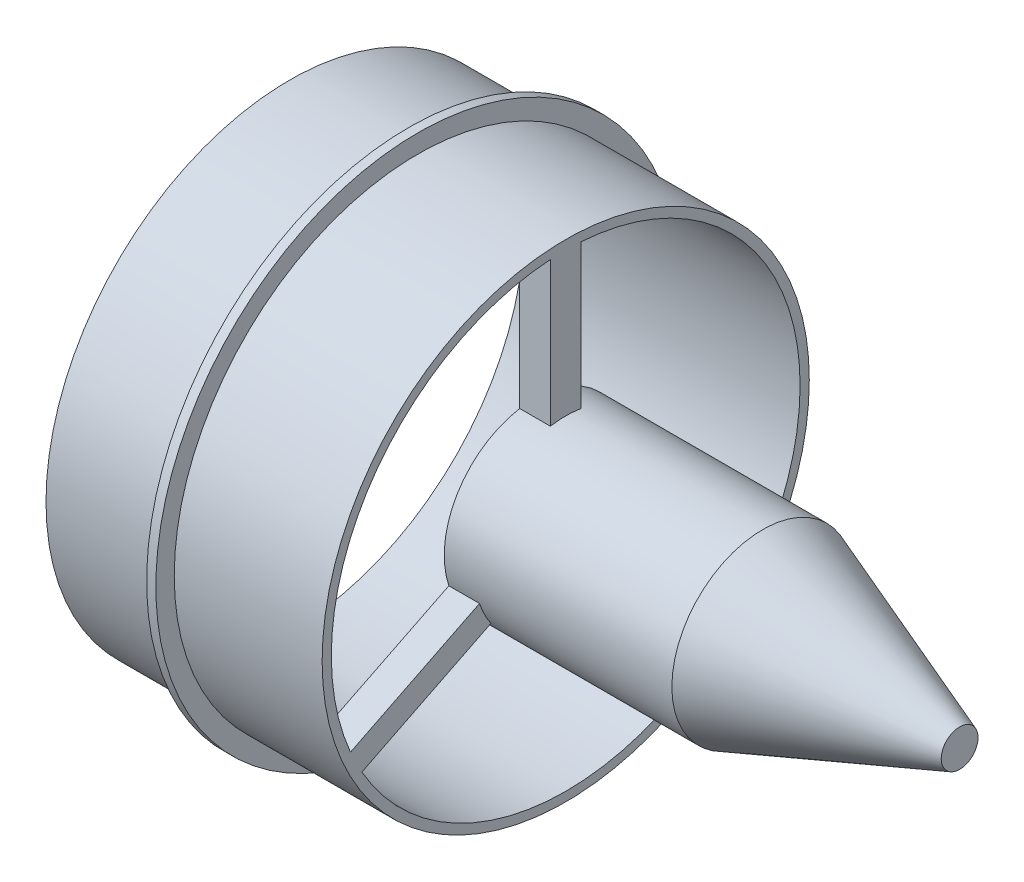
ISO-10303-21;
HEADER;
FILE_DESCRIPTION(('STEP AP214'),'2;1');
FILE_NAME('part.step','',(''),(''),'','','');
FILE_SCHEMA(('AUTOMOTIVE_DESIGN { 1 0 10303 214 1 1 1 1 }'));
ENDSEC;
DATA;
#1=APPLICATION_CONTEXT('core data for automotive mechanical design processes');
#2=APPLICATION_PROTOCOL_DEFINITION('international standard','automotive_design',2000,#1);
#3=PRODUCT_CONTEXT('',#1,'mechanical');
#4=PRODUCT('Part','Part','',(#3));
#5=PRODUCT_RELATED_PRODUCT_CATEGORY('part','',(#4));
#6=PRODUCT_DEFINITION_FORMATION('','',#4);
#7=PRODUCT_DEFINITION_CONTEXT('part definition',#1,'design');
#8=PRODUCT_DEFINITION('design','',#6,#7);
#9=PRODUCT_DEFINITION_SHAPE('','',#8);
#10=(LENGTH_UNIT() NAMED_UNIT(*) SI_UNIT(.MILLI.,.METRE.));
#11=(NAMED_UNIT(*) PLANE_ANGLE_UNIT() SI_UNIT($,.RADIAN.));
#12=(NAMED_UNIT(*) SI_UNIT($,.STERADIAN.) SOLID_ANGLE_UNIT());
#13=UNCERTAINTY_MEASURE_WITH_UNIT(LENGTH_MEASURE(1.E-05),#10,'distance_accuracy_value','');
#14=(GEOMETRIC_REPRESENTATION_CONTEXT(3) GLOBAL_UNCERTAINTY_ASSIGNED_CONTEXT((#13)) GLOBAL_UNIT_ASSIGNED_CONTEXT((#10,
#11,#12)) REPRESENTATION_CONTEXT('',''));
#15=CARTESIAN_POINT('',(0.,0.,0.));
#16=DIRECTION('',(0.,0.,1.));
#17=DIRECTION('',(1.,0.,0.));
#18=AXIS2_PLACEMENT_3D('',#15,#16,#17);
#19=CARTESIAN_POINT('',(45.,0.,0.));
#20=DIRECTION('',(-1.,0.,0.));
#21=DIRECTION('',(0.,0.,1.));
#22=AXIS2_PLACEMENT_3D('',#19,#20,#21);
#23=CYLINDRICAL_SURFACE('',#22,39.7);
#24=CARTESIAN_POINT('',(0.,0.,0.));
#25=DIRECTION('',(1.,0.,0.));
#26=DIRECTION('',(0.,0.,-1.));
#27=AXIS2_PLACEMENT_3D('',#24,#25,#26);
#28=CIRCLE('',#27,39.7);
#29=CARTESIAN_POINT('',(0.,0.,39.7));
#30=VERTEX_POINT('',#29);
#31=EDGE_CURVE('E175',#30,#30,#28,.T.);
#32=CARTESIAN_POINT('',(19.4,0.,0.));
#33=DIRECTION('',(1.,0.,0.));
#34=DIRECTION('',(0.,0.,-1.));
#35=AXIS2_PLACEMENT_3D('',#32,#33,#34);
#36=CIRCLE('',#35,39.7);
#37=CARTESIAN_POINT('',(19.4,0.,39.7));
#38=VERTEX_POINT('',#37);
#39=EDGE_CURVE('E168',#38,#38,#36,.T.);
#40=CARTESIAN_POINT('',(0.,0.,39.7));
#41=CARTESIAN_POINT('',(0.202083333333327,0.,39.7));
#42=CARTESIAN_POINT('',(0.404166666666662,0.,39.7));
#43=CARTESIAN_POINT('',(0.808333333333328,0.,39.7));
#44=CARTESIAN_POINT('',(1.01041666666666,0.,39.7));
#45=CARTESIAN_POINT('',(1.41458333333333,0.,39.7));
#46=CARTESIAN_POINT('',(1.61666666666666,0.,39.7));
#47=CARTESIAN_POINT('',(2.02083333333333,0.,39.7));
#48=CARTESIAN_POINT('',(2.22291666666666,0.,39.7));
#49=CARTESIAN_POINT('',(2.62708333333333,0.,39.7));
#50=CARTESIAN_POINT('',(2.82916666666666,0.,39.7));
#51=CARTESIAN_POINT('',(3.23333333333333,0.,39.7));
#52=CARTESIAN_POINT('',(3.43541666666666,0.,39.7));
#53=CARTESIAN_POINT('',(3.83958333333333,0.,39.7));
#54=CARTESIAN_POINT('',(4.04166666666666,0.,39.7));
#55=CARTESIAN_POINT('',(4.44583333333333,0.,39.7));
#56=CARTESIAN_POINT('',(4.64791666666666,0.,39.7));
#57=CARTESIAN_POINT('',(5.05208333333333,0.,39.7));
#58=CARTESIAN_POINT('',(5.25416666666666,0.,39.7));
#59=CARTESIAN_POINT('',(5.65833333333333,0.,39.7));
#60=CARTESIAN_POINT('',(5.86041666666666,0.,39.7));
#61=CARTESIAN_POINT('',(6.26458333333333,0.,39.7));
#62=CARTESIAN_POINT('',(6.46666666666666,0.,39.7));
#63=CARTESIAN_POINT('',(6.87083333333333,0.,39.7));
#64=CARTESIAN_POINT('',(7.07291666666666,0.,39.7));
#65=CARTESIAN_POINT('',(7.47708333333333,0.,39.7));
#66=CARTESIAN_POINT('',(7.67916666666666,0.,39.7));
#67=CARTESIAN_POINT('',(8.08333333333333,0.,39.7));
#68=CARTESIAN_POINT('',(8.28541666666666,0.,39.7));
#69=CARTESIAN_POINT('',(8.68958333333333,0.,39.7));
#70=CARTESIAN_POINT('',(8.89166666666666,0.,39.7));
#71=CARTESIAN_POINT('',(9.29583333333333,0.,39.7));
#72=CARTESIAN_POINT('',(9.49791666666666,0.,39.7));
#73=CARTESIAN_POINT('',(9.90208333333333,0.,39.7));
#74=CARTESIAN_POINT('',(10.1041666666667,0.,39.7));
#75=CARTESIAN_POINT('',(10.5083333333333,0.,39.7));
#76=CARTESIAN_POINT('',(10.7104166666667,0.,39.7));
#77=CARTESIAN_POINT('',(11.1145833333333,0.,39.7));
#78=CARTESIAN_POINT('',(11.3166666666667,0.,39.7));
#79=CARTESIAN_POINT('',(11.7208333333333,0.,39.7));
#80=CARTESIAN_POINT('',(11.9229166666667,0.,39.7));
#81=CARTESIAN_POINT('',(12.3270833333333,0.,39.7));
#82=CARTESIAN_POINT('',(12.5291666666667,0.,39.7));
#83=CARTESIAN_POINT('',(12.9333333333333,0.,39.7));
#84=CARTESIAN_POINT('',(13.1354166666667,0.,39.7));
#85=CARTESIAN_POINT('',(13.5395833333333,0.,39.7));
#86=CARTESIAN_POINT('',(13.7416666666667,0.,39.7));
#87=CARTESIAN_POINT('',(14.1458333333333,0.,39.7));
#88=CARTESIAN_POINT('',(14.3479166666667,0.,39.7));
#89=CARTESIAN_POINT('',(14.7520833333333,0.,39.7));
#90=CARTESIAN_POINT('',(14.9541666666667,0.,39.7));
#91=CARTESIAN_POINT('',(15.3583333333333,0.,39.7));
#92=CARTESIAN_POINT('',(15.5604166666667,0.,39.7));
#93=CARTESIAN_POINT('',(15.9645833333333,0.,39.7));
#94=CARTESIAN_POINT('',(16.1666666666667,0.,39.7));
#95=CARTESIAN_POINT('',(16.5708333333333,0.,39.7));
#96=CARTESIAN_POINT('',(16.7729166666667,0.,39.7));
#97=CARTESIAN_POINT('',(17.1770833333333,0.,39.7));
#98=CARTESIAN_POINT('',(17.3791666666667,0.,39.7));
#99=CARTESIAN_POINT('',(17.7833333333333,0.,39.7));
#100=CARTESIAN_POINT('',(17.9854166666667,0.,39.7));
#101=CARTESIAN_POINT('',(18.3895833333333,0.,39.7));
#102=CARTESIAN_POINT('',(18.5916666666667,0.,39.7));
#103=CARTESIAN_POINT('',(18.9958333333333,0.,39.7));
#104=CARTESIAN_POINT('',(19.1979166666667,0.,39.7));
#105=CARTESIAN_POINT('',(19.4,0.,39.7));
#106=B_SPLINE_CURVE_WITH_KNOTS('',3,(#40,#41,#42,#43,#44,#45,#46,#47,#48,#49,#50,#51,#52,#53,
#54,#55,#56,#57,#58,#59,#60,#61,#62,#63,#64,#65,#66,#67,#68,#69,#70,#71,#72,#73,#74,#75,#76,#77,
#78,#79,#80,#81,#82,#83,#84,#85,#86,#87,#88,#89,#90,#91,#92,#93,#94,#95,#96,#97,#98,#99,#100,
#101,#102,#103,#104,#105),.UNSPECIFIED.,.F.,.F.,(4,2,2,2,2,2,2,2,2,2,2,2,2,2,2,2,2,2,2,2,2,2,2,
2,2,2,2,2,2,2,2,2,4),(0.,0.606250000000003,1.2125,1.81875,2.425,3.03125,3.6375,4.24375,4.85,
5.45625,6.0625,6.66875,7.275,7.88125000000001,8.4875,9.09375000000001,9.7,10.30625,10.9125,
11.51875,12.125,12.73125,13.3375,13.94375,14.55,15.15625,15.7625,16.36875,16.975,17.58125,
18.1875,18.79375,19.4),.UNSPECIFIED.);
#107=EDGE_CURVE('BSEAM41',#30,#38,#106,.T.);
#108=ORIENTED_EDGE('',*,*,#31,.T.);
#109=ORIENTED_EDGE('',*,*,#39,.F.);
#110=ORIENTED_EDGE('',*,*,#107,.T.);
#111=ORIENTED_EDGE('',*,*,#107,.F.);
#112=EDGE_LOOP('',(#108,#110,#109,#111));
#113=FACE_BOUND('',#112,.T.);
#114=ADVANCED_FACE('F41',(#113),#23,.T.);
#115=CARTESIAN_POINT('',(20.9,0.,0.));
#116=DIRECTION('',(1.,0.,0.));
#117=DIRECTION('',(0.,0.,-1.));
#118=AXIS2_PLACEMENT_3D('',#115,#116,#117);
#119=CIRCLE('',#118,39.7);
#120=CARTESIAN_POINT('',(20.9,0.,39.7));
#121=VERTEX_POINT('',#120);
#122=EDGE_CURVE('E191',#121,#121,#119,.T.);
#123=CARTESIAN_POINT('',(45.,0.,0.));
#124=DIRECTION('',(1.,0.,0.));
#125=DIRECTION('',(0.,0.,-1.));
#126=AXIS2_PLACEMENT_3D('',#123,#124,#125);
#127=CIRCLE('',#126,39.7);
#128=CARTESIAN_POINT('',(45.,0.,39.7));
#129=VERTEX_POINT('',#128);
#130=EDGE_CURVE('E170',#129,#129,#127,.T.);
#131=CARTESIAN_POINT('',(20.9,0.,39.7));
#132=CARTESIAN_POINT('',(21.1510416666667,0.,39.7));
#133=CARTESIAN_POINT('',(21.4020833333333,0.,39.7));
#134=CARTESIAN_POINT('',(21.9041666666667,0.,39.7));
#135=CARTESIAN_POINT('',(22.1552083333333,0.,39.7));
#136=CARTESIAN_POINT('',(22.6572916666667,0.,39.7));
#137=CARTESIAN_POINT('',(22.9083333333333,0.,39.7));
#138=CARTESIAN_POINT('',(23.4104166666667,0.,39.7));
#139=CARTESIAN_POINT('',(23.6614583333333,0.,39.7));
#140=CARTESIAN_POINT('',(24.1635416666667,0.,39.7));
#141=CARTESIAN_POINT('',(24.4145833333333,0.,39.7));
#142=CARTESIAN_POINT('',(24.9166666666667,0.,39.7));
#143=CARTESIAN_POINT('',(25.1677083333333,0.,39.7));
#144=CARTESIAN_POINT('',(25.6697916666667,0.,39.7));
#145=CARTESIAN_POINT('',(25.9208333333333,0.,39.7));
#146=CARTESIAN_POINT('',(26.4229166666667,0.,39.7));
#147=CARTESIAN_POINT('',(26.6739583333333,0.,39.7));
#148=CARTESIAN_POINT('',(27.1760416666667,0.,39.7));
#149=CARTESIAN_POINT('',(27.4270833333333,0.,39.7));
#150=CARTESIAN_POINT('',(27.9291666666667,0.,39.7));
#151=CARTESIAN_POINT('',(28.1802083333333,0.,39.7));
#152=CARTESIAN_POINT('',(28.6822916666667,0.,39.7));
#153=CARTESIAN_POINT('',(28.9333333333333,0.,39.7));
#154=CARTESIAN_POINT('',(29.4354166666667,0.,39.7));
#155=CARTESIAN_POINT('',(29.6864583333333,0.,39.7));
#156=CARTESIAN_POINT('',(30.1885416666667,0.,39.7));
#157=CARTESIAN_POINT('',(30.4395833333333,0.,39.7));
#158=CARTESIAN_POINT('',(30.9416666666667,0.,39.7));
#159=CARTESIAN_POINT('',(31.1927083333333,0.,39.7));
#160=CARTESIAN_POINT('',(31.6947916666667,0.,39.7));
#161=CARTESIAN_POINT('',(31.9458333333333,0.,39.7));
#162=CARTESIAN_POINT('',(32.4479166666667,0.,39.7));
#163=CARTESIAN_POINT('',(32.6989583333333,0.,39.7));
#164=CARTESIAN_POINT('',(33.2010416666667,0.,39.7));
#165=CARTESIAN_POINT('',(33.4520833333333,0.,39.7));
#166=CARTESIAN_POINT('',(33.9541666666667,0.,39.7));
#167=CARTESIAN_POINT('',(34.2052083333333,0.,39.7));
#168=CARTESIAN_POINT('',(34.7072916666667,0.,39.7));
#169=CARTESIAN_POINT('',(34.9583333333333,0.,39.7));
#170=CARTESIAN_POINT('',(35.4604166666667,0.,39.7));
#171=CARTESIAN_POINT('',(35.7114583333333,0.,39.7));
#172=CARTESIAN_POINT('',(36.2135416666667,0.,39.7));
#173=CARTESIAN_POINT('',(36.4645833333333,0.,39.7));
#174=CARTESIAN_POINT('',(36.9666666666667,0.,39.7));
#175=CARTESIAN_POINT('',(37.2177083333333,0.,39.7));
#176=CARTESIAN_POINT('',(37.7197916666667,0.,39.7));
#177=CARTESIAN_POINT('',(37.9708333333333,0.,39.7));
#178=CARTESIAN_POINT('',(38.4729166666667,0.,39.7));
#179=CARTESIAN_POINT('',(38.7239583333333,0.,39.7));
#180=CARTESIAN_POINT('',(39.2260416666667,0.,39.7));
#181=CARTESIAN_POINT('',(39.4770833333333,0.,39.7));
#182=CARTESIAN_POINT('',(39.9791666666667,0.,39.7));
#183=CARTESIAN_POINT('',(40.2302083333333,0.,39.7));
#184=CARTESIAN_POINT('',(40.7322916666667,0.,39.7));
#185=CARTESIAN_POINT('',(40.9833333333333,0.,39.7));
#186=CARTESIAN_POINT('',(41.4854166666667,0.,39.7));
#187=CARTESIAN_POINT('',(41.7364583333333,0.,39.7));
#188=CARTESIAN_POINT('',(42.2385416666667,0.,39.7));
#189=CARTESIAN_POINT('',(42.4895833333333,0.,39.7));
#190=CARTESIAN_POINT('',(42.9916666666667,0.,39.7));
#191=CARTESIAN_POINT('',(43.2427083333333,0.,39.7));
#192=CARTESIAN_POINT('',(43.7447916666667,0.,39.7));
#193=CARTESIAN_POINT('',(43.9958333333333,0.,39.7));
#194=CARTESIAN_POINT('',(44.4979166666667,0.,39.7));
#195=CARTESIAN_POINT('',(44.7489583333333,0.,39.7));
#196=CARTESIAN_POINT('',(45.,0.,39.7));
#197=B_SPLINE_CURVE_WITH_KNOTS('',3,(#131,#132,#133,#134,#135,#136,#137,#138,#139,#140,#141,
#142,#143,#144,#145,#146,#147,#148,#149,#150,#151,#152,#153,#154,#155,#156,#157,#158,#159,#160,
#161,#162,#163,#164,#165,#166,#167,#168,#169,#170,#171,#172,#173,#174,#175,#176,#177,#178,#179,
#180,#181,#182,#183,#184,#185,#186,#187,#188,#189,#190,#191,#192,#193,#194,#195,#196),
.UNSPECIFIED.,.F.,.F.,(4,2,2,2,2,2,2,2,2,2,2,2,2,2,2,2,2,2,2,2,2,2,2,2,2,2,2,2,2,2,2,2,4),(0.,
0.753125,1.50625,2.259375,3.0125,3.765625,4.51875,5.271875,6.025,6.778125,7.53125,8.284375,
9.0375,9.790625,10.54375,11.296875,12.05,12.803125,13.55625,14.309375,15.0625,15.815625,
16.56875,17.321875,18.075,18.828125,19.58125,20.334375,21.0875,21.840625,22.59375,23.346875,
24.1),.UNSPECIFIED.);
#198=EDGE_CURVE('BSEAM43',#121,#129,#197,.T.);
#199=ORIENTED_EDGE('',*,*,#122,.T.);
#200=ORIENTED_EDGE('',*,*,#130,.F.);
#201=ORIENTED_EDGE('',*,*,#198,.T.);
#202=ORIENTED_EDGE('',*,*,#198,.F.);
#203=EDGE_LOOP('',(#199,#201,#200,#202));
#204=FACE_BOUND('',#203,.T.);
#205=ADVANCED_FACE('F43',(#204),#23,.T.);
#206=CARTESIAN_POINT('',(45.,0.,0.));
#207=DIRECTION('',(1.,0.,0.));
#208=DIRECTION('',(0.,0.,-1.));
#209=AXIS2_PLACEMENT_3D('',#206,#207,#208);
#210=PLANE('',#209);
#211=CARTESIAN_POINT('',(45.,0.,0.));
#212=DIRECTION('',(1.,0.,0.));
#213=DIRECTION('',(0.,0.,-1.));
#214=AXIS2_PLACEMENT_3D('',#211,#212,#213);
#215=CIRCLE('',#214,14.8);
#216=CARTESIAN_POINT('',(45.,14.5873232637109,-2.5));
#217=VERTEX_POINT('',#216);
#218=CARTESIAN_POINT('',(45.,14.5873232637109,2.5));
#219=VERTEX_POINT('',#218);
#220=EDGE_CURVE('E52',#217,#219,#215,.T.);
#221=ORIENTED_EDGE('',*,*,#220,.F.);
#222=DIRECTION('',(0.,1.,0.));
#223=VECTOR('',#222,1.);
#224=CARTESIAN_POINT('',(45.,14.5873232637109,-2.5));
#225=LINE('',#224,#223);
#226=CARTESIAN_POINT('',(45.,38.1181059340571,-2.5));
#227=VERTEX_POINT('',#226);
#228=EDGE_CURVE('E133',#217,#227,#225,.T.);
#229=ORIENTED_EDGE('',*,*,#228,.T.);
#230=CARTESIAN_POINT('',(45.,0.,0.));
#231=DIRECTION('',(-1.,0.,0.));
#232=DIRECTION('',(0.,0.,1.));
#233=AXIS2_PLACEMENT_3D('',#230,#231,#232);
#234=CIRCLE('',#233,38.2);
#235=CARTESIAN_POINT('',(45.,-15.1312278528921,-35.0754321949689));
#236=VERTEX_POINT('',#235);
#237=EDGE_CURVE('E179',#227,#236,#234,.T.);
#238=ORIENTED_EDGE('',*,*,#237,.T.);
#239=DIRECTION('',(0.,0.445659530203826,0.895202537495569));
#240=VECTOR('',#239,1.);
#241=CARTESIAN_POINT('',(45.,-4.66234567366432,-14.0464419985726));
#242=LINE('',#241,#240);
#243=CARTESIAN_POINT('',(45.,-4.66234567366432,-14.0464419985726));
#244=VERTEX_POINT('',#243);
#245=EDGE_CURVE('E145',#236,#244,#242,.T.);
#246=ORIENTED_EDGE('',*,*,#245,.T.);
#247=CARTESIAN_POINT('',(45.,-8.39746558109926,-12.1869837045207));
#248=VERTEX_POINT('',#247);
#249=EDGE_CURVE('E50',#248,#244,#215,.T.);
#250=ORIENTED_EDGE('',*,*,#249,.F.);
#251=DIRECTION('',(0.,-0.445659530203826,-0.895202537495569));
#252=VECTOR('',#251,1.);
#253=CARTESIAN_POINT('',(45.,-8.39746558109925,-12.1869837045207));
#254=LINE('',#253,#252);
#255=CARTESIAN_POINT('',(45.,-18.866347760327,-33.215973900917));
#256=VERTEX_POINT('',#255);
#257=EDGE_CURVE('E66',#248,#256,#254,.T.);
#258=ORIENTED_EDGE('',*,*,#257,.T.);
#259=CARTESIAN_POINT('',(45.,-18.866347760327,33.2159739009171));
#260=VERTEX_POINT('',#259);
#261=EDGE_CURVE('E187',#256,#260,#234,.T.);
#262=ORIENTED_EDGE('',*,*,#261,.T.);
#263=DIRECTION('',(0.,0.445659530203826,-0.895202537495569));
#264=VECTOR('',#263,1.);
#265=CARTESIAN_POINT('',(45.,-8.39746558109925,12.1869837045207));
#266=LINE('',#265,#264);
#267=CARTESIAN_POINT('',(45.,-8.39746558109925,12.1869837045207));
#268=VERTEX_POINT('',#267);
#269=EDGE_CURVE('E223',#260,#268,#266,.T.);
#270=ORIENTED_EDGE('',*,*,#269,.T.);
#271=CARTESIAN_POINT('',(45.,-4.66234567366432,14.0464419985726));
#272=VERTEX_POINT('',#271);
#273=EDGE_CURVE('E12',#272,#268,#215,.T.);
#274=ORIENTED_EDGE('',*,*,#273,.F.);
#275=DIRECTION('',(0.,-0.445659530203826,0.895202537495569));
#276=VECTOR('',#275,1.);
#277=CARTESIAN_POINT('',(45.,-4.66234567366432,14.0464419985726));
#278=LINE('',#277,#276);
#279=CARTESIAN_POINT('',(45.,-15.1312278528921,35.0754321949689));
#280=VERTEX_POINT('',#279);
#281=EDGE_CURVE('E59',#272,#280,#278,.T.);
#282=ORIENTED_EDGE('',*,*,#281,.T.);
#283=CARTESIAN_POINT('',(45.,38.1181059340571,2.5));
#284=VERTEX_POINT('',#283);
#285=EDGE_CURVE('E184',#280,#284,#234,.T.);
#286=ORIENTED_EDGE('',*,*,#285,.T.);
#287=DIRECTION('',(0.,-1.,0.));
#288=VECTOR('',#287,1.);
#289=CARTESIAN_POINT('',(45.,14.5873232637109,2.5));
#290=LINE('',#289,#288);
#291=EDGE_CURVE('E144',#284,#219,#290,.T.);
#292=ORIENTED_EDGE('',*,*,#291,.T.);
#293=EDGE_LOOP('',(#221,#229,#238,#246,#250,#258,#262,#270,#274,#282,#286,#292));
#294=FACE_BOUND('',#293,.T.);
#295=ORIENTED_EDGE('',*,*,#130,.T.);
#296=EDGE_LOOP('',(#295));
#297=FACE_BOUND('',#296,.T.);
#298=ADVANCED_FACE('F158',(#294,#297),#210,.T.);
#299=CARTESIAN_POINT('',(0.,0.,0.));
#300=DIRECTION('',(1.,0.,0.));
#301=DIRECTION('',(0.,0.,-1.));
#302=AXIS2_PLACEMENT_3D('',#299,#300,#301);
#303=PLANE('',#302);
#304=CARTESIAN_POINT('',(0.,0.,0.));
#305=DIRECTION('',(-1.,0.,0.));
#306=DIRECTION('',(0.,0.,1.));
#307=AXIS2_PLACEMENT_3D('',#304,#305,#306);
#308=CIRCLE('',#307,38.2);
#309=CARTESIAN_POINT('',(0.,0.,38.2));
#310=VERTEX_POINT('',#309);
#311=EDGE_CURVE('E181',#310,#310,#308,.T.);
#312=ORIENTED_EDGE('',*,*,#311,.F.);
#313=EDGE_LOOP('',(#312));
#314=FACE_BOUND('',#313,.T.);
#315=ORIENTED_EDGE('',*,*,#31,.F.);
#316=EDGE_LOOP('',(#315));
#317=FACE_BOUND('',#316,.T.);
#318=ADVANCED_FACE('F300',(#314,#317),#303,.F.);
#319=CARTESIAN_POINT('',(45.,0.,0.));
#320=DIRECTION('',(-1.,0.,0.));
#321=DIRECTION('',(0.,0.,1.));
#322=AXIS2_PLACEMENT_3D('',#319,#320,#321);
#323=CYLINDRICAL_SURFACE('',#322,38.2);
#324=CARTESIAN_POINT('',(40.,0.,0.));
#325=DIRECTION('',(1.,0.,0.));
#326=DIRECTION('',(0.,0.,-1.));
#327=AXIS2_PLACEMENT_3D('',#324,#325,#326);
#328=CIRCLE('',#327,38.2);
#329=CARTESIAN_POINT('',(40.,-15.1312278528921,35.0754321949689));
#330=VERTEX_POINT('',#329);
#331=CARTESIAN_POINT('',(40.,-18.866347760327,33.2159739009171));
#332=VERTEX_POINT('',#331);
#333=EDGE_CURVE('E238',#330,#332,#328,.T.);
#334=ORIENTED_EDGE('',*,*,#333,.T.);
#335=DIRECTION('',(1.,0.,0.));
#336=VECTOR('',#335,1.);
#337=CARTESIAN_POINT('',(40.,-18.866347760327,33.2159739009171));
#338=LINE('',#337,#336);
#339=EDGE_CURVE('E213',#332,#260,#338,.T.);
#340=ORIENTED_EDGE('',*,*,#339,.T.);
#341=ORIENTED_EDGE('',*,*,#261,.F.);
#342=DIRECTION('',(1.,0.,0.));
#343=VECTOR('',#342,1.);
#344=CARTESIAN_POINT('',(40.,-18.866347760327,-33.215973900917));
#345=LINE('',#344,#343);
#346=CARTESIAN_POINT('',(40.,-18.866347760327,-33.215973900917));
#347=VERTEX_POINT('',#346);
#348=EDGE_CURVE('E196',#347,#256,#345,.T.);
#349=ORIENTED_EDGE('',*,*,#348,.F.);
#350=CARTESIAN_POINT('',(40.,0.,0.));
#351=DIRECTION('',(1.,0.,0.));
#352=DIRECTION('',(0.,0.,1.));
#353=AXIS2_PLACEMENT_3D('',#350,#351,#352);
#354=CIRCLE('',#353,38.2);
#355=CARTESIAN_POINT('',(40.,-15.1312278528921,-35.0754321949689));
#356=VERTEX_POINT('',#355);
#357=EDGE_CURVE('E222',#347,#356,#354,.T.);
#358=ORIENTED_EDGE('',*,*,#357,.T.);
#359=DIRECTION('',(1.,0.,0.));
#360=VECTOR('',#359,1.);
#361=CARTESIAN_POINT('',(40.,-15.1312278528921,-35.0754321949689));
#362=LINE('',#361,#360);
#363=EDGE_CURVE('E197',#356,#236,#362,.T.);
#364=ORIENTED_EDGE('',*,*,#363,.T.);
#365=ORIENTED_EDGE('',*,*,#237,.F.);
#366=DIRECTION('',(1.,0.,0.));
#367=VECTOR('',#366,1.);
#368=CARTESIAN_POINT('',(40.,38.1181059340571,-2.5));
#369=LINE('',#368,#367);
#370=CARTESIAN_POINT('',(40.,38.1181059340571,-2.5));
#371=VERTEX_POINT('',#370);
#372=EDGE_CURVE('E140',#371,#227,#369,.T.);
#373=ORIENTED_EDGE('',*,*,#372,.F.);
#374=CARTESIAN_POINT('',(40.,0.,0.));
#375=DIRECTION('',(1.,0.,0.));
#376=DIRECTION('',(0.,0.,-1.));
#377=AXIS2_PLACEMENT_3D('',#374,#375,#376);
#378=CIRCLE('',#377,38.2);
#379=CARTESIAN_POINT('',(40.,38.1181059340571,2.5));
#380=VERTEX_POINT('',#379);
#381=EDGE_CURVE('E250',#371,#380,#378,.T.);
#382=ORIENTED_EDGE('',*,*,#381,.T.);
#383=DIRECTION('',(1.,0.,0.));
#384=VECTOR('',#383,1.);
#385=CARTESIAN_POINT('',(40.,38.1181059340571,2.5));
#386=LINE('',#385,#384);
#387=EDGE_CURVE('E203',#380,#284,#386,.T.);
#388=ORIENTED_EDGE('',*,*,#387,.T.);
#389=ORIENTED_EDGE('',*,*,#285,.F.);
#390=DIRECTION('',(1.,0.,0.));
#391=VECTOR('',#390,1.);
#392=CARTESIAN_POINT('',(40.,-15.1312278528921,35.0754321949689));
#393=LINE('',#392,#391);
#394=EDGE_CURVE('E211',#330,#280,#393,.T.);
#395=ORIENTED_EDGE('',*,*,#394,.F.);
#396=EDGE_LOOP('',(#334,#340,#341,#349,#358,#364,#365,#373,#382,#388,#389,#395));
#397=FACE_BOUND('',#396,.T.);
#398=ORIENTED_EDGE('',*,*,#311,.T.);
#399=EDGE_LOOP('',(#398));
#400=FACE_BOUND('',#399,.T.);
#401=ADVANCED_FACE('F261',(#397,#400),#323,.F.);
#402=CARTESIAN_POINT('',(20.9,0.,0.));
#403=DIRECTION('',(1.,0.,0.));
#404=DIRECTION('',(0.,0.,-1.));
#405=AXIS2_PLACEMENT_3D('',#402,#403,#404);
#406=PLANE('',#405);
#407=CARTESIAN_POINT('',(20.9,0.,0.));
#408=DIRECTION('',(1.,0.,0.));
#409=DIRECTION('',(0.,0.,-1.));
#410=AXIS2_PLACEMENT_3D('',#407,#408,#409);
#411=CIRCLE('',#410,42.7);
#412=CARTESIAN_POINT('',(20.9,0.,-42.7));
#413=VERTEX_POINT('',#412);
#414=EDGE_CURVE('E185',#413,#413,#411,.T.);
#415=ORIENTED_EDGE('',*,*,#414,.T.);
#416=EDGE_LOOP('',(#415));
#417=FACE_BOUND('',#416,.T.);
#418=ORIENTED_EDGE('',*,*,#122,.F.);
#419=EDGE_LOOP('',(#418));
#420=FACE_BOUND('',#419,.T.);
#421=ADVANCED_FACE('F307',(#417,#420),#406,.T.);
#422=CARTESIAN_POINT('',(19.4,0.,0.));
#423=DIRECTION('',(1.,0.,0.));
#424=DIRECTION('',(0.,0.,-1.));
#425=AXIS2_PLACEMENT_3D('',#422,#423,#424);
#426=PLANE('',#425);
#427=CARTESIAN_POINT('',(19.4,0.,0.));
#428=DIRECTION('',(1.,0.,0.));
#429=DIRECTION('',(0.,0.,-1.));
#430=AXIS2_PLACEMENT_3D('',#427,#428,#429);
#431=CIRCLE('',#430,42.7);
#432=CARTESIAN_POINT('',(19.4,0.,-42.7));
#433=VERTEX_POINT('',#432);
#434=EDGE_CURVE('E188',#433,#433,#431,.T.);
#435=ORIENTED_EDGE('',*,*,#434,.F.);
#436=EDGE_LOOP('',(#435));
#437=FACE_BOUND('',#436,.T.);
#438=ORIENTED_EDGE('',*,*,#39,.T.);
#439=EDGE_LOOP('',(#438));
#440=FACE_BOUND('',#439,.T.);
#441=ADVANCED_FACE('F316',(#437,#440),#426,.F.);
#442=CARTESIAN_POINT('',(20.9,0.,0.));
#443=DIRECTION('',(-1.,0.,0.));
#444=DIRECTION('',(0.,0.,1.));
#445=AXIS2_PLACEMENT_3D('',#442,#443,#444);
#446=CYLINDRICAL_SURFACE('',#445,42.7);
#447=ORIENTED_EDGE('',*,*,#414,.F.);
#448=EDGE_LOOP('',(#447));
#449=FACE_BOUND('',#448,.T.);
#450=ORIENTED_EDGE('',*,*,#434,.T.);
#451=EDGE_LOOP('',(#450));
#452=FACE_BOUND('',#451,.T.);
#453=ADVANCED_FACE('F313',(#449,#452),#446,.T.);
#454=CARTESIAN_POINT('',(40.,-8.39746558109925,-12.1869837045207));
#455=DIRECTION('',(0.,-0.895202537495569,0.445659530203826));
#456=DIRECTION('',(0.,-0.445659530203826,-0.895202537495569));
#457=AXIS2_PLACEMENT_3D('',#454,#455,#456);
#458=PLANE('',#457);
#459=ORIENTED_EDGE('',*,*,#257,.F.);
#460=DIRECTION('',(1.,0.,0.));
#461=VECTOR('',#460,1.);
#462=CARTESIAN_POINT('',(40.,-8.39746558109926,-12.1869837045207));
#463=LINE('',#462,#461);
#464=CARTESIAN_POINT('',(40.,-8.39746558109926,-12.1869837045207));
#465=VERTEX_POINT('',#464);
#466=EDGE_CURVE('E218',#465,#248,#463,.T.);
#467=ORIENTED_EDGE('',*,*,#466,.F.);
#468=DIRECTION('',(0.,-0.445659530203826,-0.895202537495569));
#469=VECTOR('',#468,1.);
#470=CARTESIAN_POINT('',(40.,-8.39746558109925,-12.1869837045207));
#471=LINE('',#470,#469);
#472=EDGE_CURVE('E200',#465,#347,#471,.T.);
#473=ORIENTED_EDGE('',*,*,#472,.T.);
#474=ORIENTED_EDGE('',*,*,#348,.T.);
#475=EDGE_LOOP('',(#459,#467,#473,#474));
#476=FACE_BOUND('',#475,.T.);
#477=ADVANCED_FACE('F270',(#476),#458,.T.);
#478=CARTESIAN_POINT('',(40.,0.,0.));
#479=DIRECTION('',(1.,0.,0.));
#480=DIRECTION('',(0.,0.,-1.));
#481=AXIS2_PLACEMENT_3D('',#478,#479,#480);
#482=CYLINDRICAL_SURFACE('',#481,14.8);
#483=ORIENTED_EDGE('',*,*,#466,.T.);
#484=ORIENTED_EDGE('',*,*,#249,.T.);
#485=DIRECTION('',(1.,0.,0.));
#486=VECTOR('',#485,1.);
#487=CARTESIAN_POINT('',(40.,-4.66234567366432,-14.0464419985726));
#488=LINE('',#487,#486);
#489=CARTESIAN_POINT('',(40.,-4.66234567366432,-14.0464419985726));
#490=VERTEX_POINT('',#489);
#491=EDGE_CURVE('E155',#490,#244,#488,.T.);
#492=ORIENTED_EDGE('',*,*,#491,.F.);
#493=CARTESIAN_POINT('',(40.,0.,0.));
#494=DIRECTION('',(1.,0.,0.));
#495=DIRECTION('',(0.,0.,-1.));
#496=AXIS2_PLACEMENT_3D('',#493,#494,#495);
#497=CIRCLE('',#496,14.8);
#498=CARTESIAN_POINT('',(40.,14.5873232637109,-2.5));
#499=VERTEX_POINT('',#498);
#500=EDGE_CURVE('E154',#490,#499,#497,.T.);
#501=ORIENTED_EDGE('',*,*,#500,.T.);
#502=DIRECTION('',(1.,0.,0.));
#503=VECTOR('',#502,1.);
#504=CARTESIAN_POINT('',(40.,14.5873232637109,-2.5));
#505=LINE('',#504,#503);
#506=EDGE_CURVE('E137',#499,#217,#505,.T.);
#507=ORIENTED_EDGE('',*,*,#506,.T.);
#508=ORIENTED_EDGE('',*,*,#220,.T.);
#509=DIRECTION('',(1.,0.,0.));
#510=VECTOR('',#509,1.);
#511=CARTESIAN_POINT('',(40.,14.5873232637109,2.5));
#512=LINE('',#511,#510);
#513=CARTESIAN_POINT('',(40.,14.5873232637109,2.5));
#514=VERTEX_POINT('',#513);
#515=EDGE_CURVE('E206',#514,#219,#512,.T.);
#516=ORIENTED_EDGE('',*,*,#515,.F.);
#517=CARTESIAN_POINT('',(40.,0.,0.));
#518=DIRECTION('',(1.,0.,0.));
#519=DIRECTION('',(0.,0.,-1.));
#520=AXIS2_PLACEMENT_3D('',#517,#518,#519);
#521=CIRCLE('',#520,14.8);
#522=CARTESIAN_POINT('',(40.,-4.66234567366432,14.0464419985726));
#523=VERTEX_POINT('',#522);
#524=EDGE_CURVE('E244',#514,#523,#521,.T.);
#525=ORIENTED_EDGE('',*,*,#524,.T.);
#526=DIRECTION('',(1.,0.,0.));
#527=VECTOR('',#526,1.);
#528=CARTESIAN_POINT('',(40.,-4.66234567366432,14.0464419985726));
#529=LINE('',#528,#527);
#530=EDGE_CURVE('E208',#523,#272,#529,.T.);
#531=ORIENTED_EDGE('',*,*,#530,.T.);
#532=ORIENTED_EDGE('',*,*,#273,.T.);
#533=DIRECTION('',(1.,0.,0.));
#534=VECTOR('',#533,1.);
#535=CARTESIAN_POINT('',(40.,-8.39746558109925,12.1869837045207));
#536=LINE('',#535,#534);
#537=CARTESIAN_POINT('',(40.,-8.39746558109925,12.1869837045207));
#538=VERTEX_POINT('',#537);
#539=EDGE_CURVE('E216',#538,#268,#536,.T.);
#540=ORIENTED_EDGE('',*,*,#539,.F.);
#541=CARTESIAN_POINT('',(40.,0.,0.));
#542=DIRECTION('',(1.,0.,0.));
#543=DIRECTION('',(0.,0.,-1.));
#544=AXIS2_PLACEMENT_3D('',#541,#542,#543);
#545=CIRCLE('',#544,14.8);
#546=EDGE_CURVE('E232',#538,#465,#545,.T.);
#547=ORIENTED_EDGE('',*,*,#546,.T.);
#548=EDGE_LOOP('',(#483,#484,#492,#501,#507,#508,#516,#525,#531,#532,#540,#547));
#549=FACE_BOUND('',#548,.T.);
#550=CARTESIAN_POINT('',(77.1,0.,0.));
#551=DIRECTION('',(-1.,0.,0.));
#552=DIRECTION('',(0.,0.,1.));
#553=AXIS2_PLACEMENT_3D('',#550,#551,#552);
#554=CIRCLE('',#553,14.8);
#555=CARTESIAN_POINT('',(77.1,0.,14.8));
#556=VERTEX_POINT('',#555);
#557=EDGE_CURVE('E160',#556,#556,#554,.F.);
#558=ORIENTED_EDGE('',*,*,#557,.F.);
#559=EDGE_LOOP('',(#558));
#560=FACE_BOUND('',#559,.T.);
#561=ADVANCED_FACE('F151',(#549,#560),#482,.T.);
#562=CARTESIAN_POINT('',(40.,-8.39746558109925,12.1869837045207));
#563=DIRECTION('',(0.,-0.895202537495569,-0.445659530203826));
#564=DIRECTION('',(0.,0.445659530203826,-0.895202537495569));
#565=AXIS2_PLACEMENT_3D('',#562,#563,#564);
#566=PLANE('',#565);
#567=ORIENTED_EDGE('',*,*,#269,.F.);
#568=ORIENTED_EDGE('',*,*,#339,.F.);
#569=DIRECTION('',(0.,0.445659530203826,-0.895202537495569));
#570=VECTOR('',#569,1.);
#571=CARTESIAN_POINT('',(40.,-8.39746558109925,12.1869837045207));
#572=LINE('',#571,#570);
#573=EDGE_CURVE('E235',#332,#538,#572,.T.);
#574=ORIENTED_EDGE('',*,*,#573,.T.);
#575=ORIENTED_EDGE('',*,*,#539,.T.);
#576=EDGE_LOOP('',(#567,#568,#574,#575));
#577=FACE_BOUND('',#576,.T.);
#578=ADVANCED_FACE('F273',(#577),#566,.T.);
#579=CARTESIAN_POINT('',(40.,-4.66234567366432,14.0464419985726));
#580=DIRECTION('',(0.,0.895202537495569,0.445659530203826));
#581=DIRECTION('',(0.,-0.445659530203826,0.895202537495569));
#582=AXIS2_PLACEMENT_3D('',#579,#580,#581);
#583=PLANE('',#582);
#584=ORIENTED_EDGE('',*,*,#281,.F.);
#585=ORIENTED_EDGE('',*,*,#530,.F.);
#586=DIRECTION('',(0.,-0.445659530203826,0.895202537495569));
#587=VECTOR('',#586,1.);
#588=CARTESIAN_POINT('',(40.,-4.66234567366432,14.0464419985726));
#589=LINE('',#588,#587);
#590=EDGE_CURVE('E241',#523,#330,#589,.T.);
#591=ORIENTED_EDGE('',*,*,#590,.T.);
#592=ORIENTED_EDGE('',*,*,#394,.T.);
#593=EDGE_LOOP('',(#584,#585,#591,#592));
#594=FACE_BOUND('',#593,.T.);
#595=ADVANCED_FACE('F282',(#594),#583,.T.);
#596=CARTESIAN_POINT('',(40.,14.5873232637109,2.5));
#597=DIRECTION('',(0.,0.,1.));
#598=DIRECTION('',(1.,0.,0.));
#599=AXIS2_PLACEMENT_3D('',#596,#597,#598);
#600=PLANE('',#599);
#601=ORIENTED_EDGE('',*,*,#291,.F.);
#602=ORIENTED_EDGE('',*,*,#387,.F.);
#603=DIRECTION('',(0.,-1.,0.));
#604=VECTOR('',#603,1.);
#605=CARTESIAN_POINT('',(40.,14.5873232637109,2.5));
#606=LINE('',#605,#604);
#607=EDGE_CURVE('E247',#380,#514,#606,.T.);
#608=ORIENTED_EDGE('',*,*,#607,.T.);
#609=ORIENTED_EDGE('',*,*,#515,.T.);
#610=EDGE_LOOP('',(#601,#602,#608,#609));
#611=FACE_BOUND('',#610,.T.);
#612=ADVANCED_FACE('F280',(#611),#600,.T.);
#613=CARTESIAN_POINT('',(40.,14.5873232637109,-2.5));
#614=DIRECTION('',(0.,0.,-1.));
#615=DIRECTION('',(-1.,0.,0.));
#616=AXIS2_PLACEMENT_3D('',#613,#614,#615);
#617=PLANE('',#616);
#618=ORIENTED_EDGE('',*,*,#228,.F.);
#619=ORIENTED_EDGE('',*,*,#506,.F.);
#620=DIRECTION('',(0.,1.,0.));
#621=VECTOR('',#620,1.);
#622=CARTESIAN_POINT('',(40.,14.5873232637109,-2.5));
#623=LINE('',#622,#621);
#624=EDGE_CURVE('E253',#499,#371,#623,.T.);
#625=ORIENTED_EDGE('',*,*,#624,.T.);
#626=ORIENTED_EDGE('',*,*,#372,.T.);
#627=EDGE_LOOP('',(#618,#619,#625,#626));
#628=FACE_BOUND('',#627,.T.);
#629=ADVANCED_FACE('F135',(#628),#617,.T.);
#630=CARTESIAN_POINT('',(40.,-4.66234567366432,-14.0464419985726));
#631=DIRECTION('',(0.,0.895202537495569,-0.445659530203826));
#632=DIRECTION('',(0.,0.445659530203826,0.895202537495569));
#633=AXIS2_PLACEMENT_3D('',#630,#631,#632);
#634=PLANE('',#633);
#635=ORIENTED_EDGE('',*,*,#245,.F.);
#636=ORIENTED_EDGE('',*,*,#363,.F.);
#637=DIRECTION('',(0.,0.445659530203826,0.895202537495569));
#638=VECTOR('',#637,1.);
#639=CARTESIAN_POINT('',(40.,-4.66234567366432,-14.0464419985726));
#640=LINE('',#639,#638);
#641=EDGE_CURVE('E256',#356,#490,#640,.T.);
#642=ORIENTED_EDGE('',*,*,#641,.T.);
#643=ORIENTED_EDGE('',*,*,#491,.T.);
#644=EDGE_LOOP('',(#635,#636,#642,#643));
#645=FACE_BOUND('',#644,.T.);
#646=ADVANCED_FACE('F324',(#645),#634,.T.);
#647=CARTESIAN_POINT('',(40.,0.,0.));
#648=DIRECTION('',(-1.,0.,0.));
#649=DIRECTION('',(0.,0.,1.));
#650=AXIS2_PLACEMENT_3D('',#647,#648,#649);
#651=PLANE('',#650);
#652=ORIENTED_EDGE('',*,*,#357,.F.);
#653=ORIENTED_EDGE('',*,*,#472,.F.);
#654=ORIENTED_EDGE('',*,*,#546,.F.);
#655=ORIENTED_EDGE('',*,*,#573,.F.);
#656=ORIENTED_EDGE('',*,*,#333,.F.);
#657=ORIENTED_EDGE('',*,*,#590,.F.);
#658=ORIENTED_EDGE('',*,*,#524,.F.);
#659=ORIENTED_EDGE('',*,*,#607,.F.);
#660=ORIENTED_EDGE('',*,*,#381,.F.);
#661=ORIENTED_EDGE('',*,*,#624,.F.);
#662=ORIENTED_EDGE('',*,*,#500,.F.);
#663=ORIENTED_EDGE('',*,*,#641,.F.);
#664=EDGE_LOOP('',(#652,#653,#654,#655,#656,#657,#658,#659,#660,#661,#662,#663));
#665=FACE_BOUND('',#664,.T.);
#666=ADVANCED_FACE('F267',(#665),#651,.T.);
#667=CARTESIAN_POINT('',(109.2,0.,0.));
#668=DIRECTION('',(1.,0.,0.));
#669=DIRECTION('',(0.,0.,-1.));
#670=AXIS2_PLACEMENT_3D('',#667,#668,#669);
#671=PLANE('',#670);
#672=CARTESIAN_POINT('',(109.2,0.,0.));
#673=DIRECTION('',(1.,0.,0.));
#674=DIRECTION('',(0.,0.,-1.));
#675=AXIS2_PLACEMENT_3D('',#672,#673,#674);
#676=CIRCLE('',#675,3.);
#677=CARTESIAN_POINT('',(109.2,0.,3.));
#678=VERTEX_POINT('',#677);
#679=EDGE_CURVE('E161',#678,#678,#676,.T.);
#680=ORIENTED_EDGE('',*,*,#679,.T.);
#681=EDGE_LOOP('',(#680));
#682=FACE_BOUND('',#681,.T.);
#683=ADVANCED_FACE('F349',(#682),#671,.T.);
#684=CARTESIAN_POINT('',(109.2,0.,0.));
#685=DIRECTION('',(-1.,0.,0.));
#686=DIRECTION('',(0.,0.,1.));
#687=AXIS2_PLACEMENT_3D('',#684,#685,#686);
#688=CONICAL_SURFACE('',#687,3.,0.352268366291728);
#689=CARTESIAN_POINT('',(77.1,0.,14.8));
#690=CARTESIAN_POINT('',(77.434375,0.,14.6770833333333));
#691=CARTESIAN_POINT('',(77.76875,0.,14.5541666666667));
#692=CARTESIAN_POINT('',(78.4375,0.,14.3083333333333));
#693=CARTESIAN_POINT('',(78.771875,0.,14.1854166666667));
#694=CARTESIAN_POINT('',(79.440625,0.,13.9395833333333));
#695=CARTESIAN_POINT('',(79.775,0.,13.8166666666667));
#696=CARTESIAN_POINT('',(80.44375,0.,13.5708333333333));
#697=CARTESIAN_POINT('',(80.778125,0.,13.4479166666667));
#698=CARTESIAN_POINT('',(81.446875,0.,13.2020833333333));
#699=CARTESIAN_POINT('',(81.78125,0.,13.0791666666667));
#700=CARTESIAN_POINT('',(82.45,0.,12.8333333333333));
#701=CARTESIAN_POINT('',(82.784375,0.,12.7104166666667));
#702=CARTESIAN_POINT('',(83.453125,0.,12.4645833333333));
#703=CARTESIAN_POINT('',(83.7875,0.,12.3416666666667));
#704=CARTESIAN_POINT('',(84.45625,0.,12.0958333333333));
#705=CARTESIAN_POINT('',(84.790625,0.,11.9729166666667));
#706=CARTESIAN_POINT('',(85.459375,0.,11.7270833333333));
#707=CARTESIAN_POINT('',(85.79375,0.,11.6041666666667));
#708=CARTESIAN_POINT('',(86.4625,0.,11.3583333333333));
#709=CARTESIAN_POINT('',(86.796875,0.,11.2354166666667));
#710=CARTESIAN_POINT('',(87.465625,0.,10.9895833333333));
#711=CARTESIAN_POINT('',(87.8,0.,10.8666666666667));
#712=CARTESIAN_POINT('',(88.46875,0.,10.6208333333333));
#713=CARTESIAN_POINT('',(88.803125,0.,10.4979166666667));
#714=CARTESIAN_POINT('',(89.471875,0.,10.2520833333333));
#715=CARTESIAN_POINT('',(89.80625,0.,10.1291666666667));
#716=CARTESIAN_POINT('',(90.475,0.,9.88333333333333));
#717=CARTESIAN_POINT('',(90.809375,0.,9.76041666666667));
#718=CARTESIAN_POINT('',(91.478125,0.,9.51458333333333));
#719=CARTESIAN_POINT('',(91.8125,0.,9.39166666666666));
#720=CARTESIAN_POINT('',(92.48125,0.,9.14583333333333));
#721=CARTESIAN_POINT('',(92.815625,0.,9.02291666666667));
#722=CARTESIAN_POINT('',(93.484375,0.,8.77708333333333));
#723=CARTESIAN_POINT('',(93.81875,0.,8.65416666666667));
#724=CARTESIAN_POINT('',(94.4875,0.,8.40833333333333));
#725=CARTESIAN_POINT('',(94.821875,0.,8.28541666666666));
#726=CARTESIAN_POINT('',(95.490625,0.,8.03958333333333));
#727=CARTESIAN_POINT('',(95.825,0.,7.91666666666667));
#728=CARTESIAN_POINT('',(96.49375,0.,7.67083333333333));
#729=CARTESIAN_POINT('',(96.828125,0.,7.54791666666667));
#730=CARTESIAN_POINT('',(97.496875,0.,7.30208333333333));
#731=CARTESIAN_POINT('',(97.83125,0.,7.17916666666667));
#732=CARTESIAN_POINT('',(98.5,0.,6.93333333333333));
#733=CARTESIAN_POINT('',(98.834375,0.,6.81041666666667));
#734=CARTESIAN_POINT('',(99.503125,0.,6.56458333333333));
#735=CARTESIAN_POINT('',(99.8375,0.,6.44166666666667));
#736=CARTESIAN_POINT('',(100.50625,0.,6.19583333333334));
#737=CARTESIAN_POINT('',(100.840625,0.,6.07291666666667));
#738=CARTESIAN_POINT('',(101.509375,0.,5.82708333333333));
#739=CARTESIAN_POINT('',(101.84375,0.,5.70416666666667));
#740=CARTESIAN_POINT('',(102.5125,0.,5.45833333333334));
#741=CARTESIAN_POINT('',(102.846875,0.,5.33541666666667));
#742=CARTESIAN_POINT('',(103.515625,0.,5.08958333333333));
#743=CARTESIAN_POINT('',(103.85,0.,4.96666666666667));
#744=CARTESIAN_POINT('',(104.51875,0.,4.72083333333333));
#745=CARTESIAN_POINT('',(104.853125,0.,4.59791666666667));
#746=CARTESIAN_POINT('',(105.521875,0.,4.35208333333334));
#747=CARTESIAN_POINT('',(105.85625,0.,4.22916666666667));
#748=CARTESIAN_POINT('',(106.525,0.,3.98333333333333));
#749=CARTESIAN_POINT('',(106.859375,0.,3.86041666666667));
#750=CARTESIAN_POINT('',(107.528125,0.,3.61458333333334));
#751=CARTESIAN_POINT('',(107.8625,0.,3.49166666666667));
#752=CARTESIAN_POINT('',(108.53125,0.,3.24583333333334));
#753=CARTESIAN_POINT('',(108.865625,0.,3.12291666666667));
#754=CARTESIAN_POINT('',(109.2,0.,3.));
#755=B_SPLINE_CURVE_WITH_KNOTS('',3,(#689,#690,#691,#692,#693,#694,#695,#696,#697,#698,#699,
#700,#701,#702,#703,#704,#705,#706,#707,#708,#709,#710,#711,#712,#713,#714,#715,#716,#717,#718,
#719,#720,#721,#722,#723,#724,#725,#726,#727,#728,#729,#730,#731,#732,#733,#734,#735,#736,#737,
#738,#739,#740,#741,#742,#743,#744,#745,#746,#747,#748,#749,#750,#751,#752,#753,#754),
.UNSPECIFIED.,.F.,.F.,(4,2,2,2,2,2,2,2,2,2,2,2,2,2,2,2,2,2,2,2,2,2,2,2,2,2,2,2,2,2,2,2,4),(0.,
1.06875456870369,2.13750913740737,3.20626370611105,4.27501827481474,5.34377284351842,
6.41252741222211,7.48128198092579,8.55003654962947,9.61879111833316,10.6875456870368,
11.7563002557405,12.8250548244442,13.8938093931479,14.9625639618516,16.0313185305553,
17.100073099259,18.1688276679626,19.2375822366663,20.30633680537,21.3750913740737,
22.4438459427774,23.5126005114811,24.5813550801848,25.6501096488884,26.7188642175921,
27.7876187862958,28.8563733549995,29.9251279237032,30.9938824924069,32.0626370611106,
33.1313916298142,34.2001461985179),.UNSPECIFIED.);
#756=EDGE_CURVE('BSEAM364',#556,#678,#755,.T.);
#757=ORIENTED_EDGE('',*,*,#557,.T.);
#758=ORIENTED_EDGE('',*,*,#679,.F.);
#759=ORIENTED_EDGE('',*,*,#756,.T.);
#760=ORIENTED_EDGE('',*,*,#756,.F.);
#761=EDGE_LOOP('',(#757,#759,#758,#760));
#762=FACE_BOUND('',#761,.T.);
#763=ADVANCED_FACE('F364',(#762),#688,.T.);
#764=CLOSED_SHELL('',(#114,#205,#298,#318,#401,#421,#441,#453,#477,#561,#578,#595,#612,#629,
#646,#666,#683,#763));
#765=MANIFOLD_SOLID_BREP('B2',#764);
#766=ADVANCED_BREP_SHAPE_REPRESENTATION('',(#18,#765),#14);
#767=SHAPE_DEFINITION_REPRESENTATION(#9,#766);
ENDSEC;
END-ISO-10303-21;
